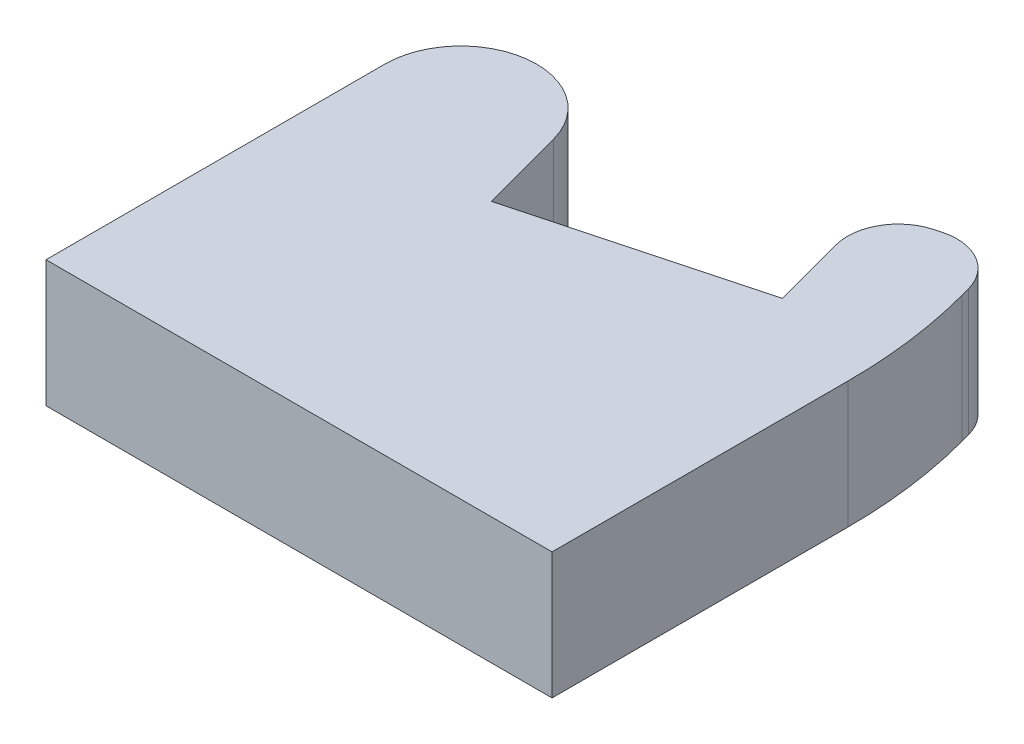
ISO-10303-21;
HEADER;
FILE_DESCRIPTION(('STEP AP214'),'2;1');
FILE_NAME('part.step','',(''),(''),'','','');
FILE_SCHEMA(('AUTOMOTIVE_DESIGN { 1 0 10303 214 1 1 1 1 }'));
ENDSEC;
DATA;
#1=APPLICATION_CONTEXT('core data for automotive mechanical design processes');
#2=APPLICATION_PROTOCOL_DEFINITION('international standard','automotive_design',2000,#1);
#3=PRODUCT_CONTEXT('',#1,'mechanical');
#4=PRODUCT('Part','Part','',(#3));
#5=PRODUCT_RELATED_PRODUCT_CATEGORY('part','',(#4));
#6=PRODUCT_DEFINITION_FORMATION('','',#4);
#7=PRODUCT_DEFINITION_CONTEXT('part definition',#1,'design');
#8=PRODUCT_DEFINITION('design','',#6,#7);
#9=PRODUCT_DEFINITION_SHAPE('','',#8);
#10=(LENGTH_UNIT() NAMED_UNIT(*) SI_UNIT(.MILLI.,.METRE.));
#11=(NAMED_UNIT(*) PLANE_ANGLE_UNIT() SI_UNIT($,.RADIAN.));
#12=(NAMED_UNIT(*) SI_UNIT($,.STERADIAN.) SOLID_ANGLE_UNIT());
#13=UNCERTAINTY_MEASURE_WITH_UNIT(LENGTH_MEASURE(1.E-05),#10,'distance_accuracy_value','');
#14=(GEOMETRIC_REPRESENTATION_CONTEXT(3) GLOBAL_UNCERTAINTY_ASSIGNED_CONTEXT((#13)) GLOBAL_UNIT_ASSIGNED_CONTEXT((#10,
#11,#12)) REPRESENTATION_CONTEXT('',''));
#15=CARTESIAN_POINT('',(0.,0.,0.));
#16=DIRECTION('',(0.,0.,1.));
#17=DIRECTION('',(1.,0.,0.));
#18=AXIS2_PLACEMENT_3D('',#15,#16,#17);
#19=CARTESIAN_POINT('',(0.,6.35,-17.0061676046821));
#20=DIRECTION('',(1.,0.,0.));
#21=DIRECTION('',(0.,0.,-1.));
#22=AXIS2_PLACEMENT_3D('',#19,#20,#21);
#23=PLANE('',#22);
#24=DIRECTION('',(0.,0.,1.));
#25=VECTOR('',#24,1.);
#26=CARTESIAN_POINT('',(0.,0.,-17.0061676046821));
#27=LINE('',#26,#25);
#28=CARTESIAN_POINT('',(0.,0.,-17.0061676046821));
#29=VERTEX_POINT('',#28);
#30=CARTESIAN_POINT('',(0.,0.,0.));
#31=VERTEX_POINT('',#30);
#32=EDGE_CURVE('E153',#29,#31,#27,.T.);
#33=ORIENTED_EDGE('',*,*,#32,.T.);
#34=DIRECTION('',(0.,-1.,0.));
#35=VECTOR('',#34,1.);
#36=CARTESIAN_POINT('',(0.,6.35,0.));
#37=LINE('',#36,#35);
#38=CARTESIAN_POINT('',(0.,6.35,0.));
#39=VERTEX_POINT('',#38);
#40=EDGE_CURVE('E11',#39,#31,#37,.T.);
#41=ORIENTED_EDGE('',*,*,#40,.F.);
#42=DIRECTION('',(0.,0.,1.));
#43=VECTOR('',#42,1.);
#44=CARTESIAN_POINT('',(0.,6.35,-17.0061676046821));
#45=LINE('',#44,#43);
#46=CARTESIAN_POINT('',(0.,6.35,-17.0061676046821));
#47=VERTEX_POINT('',#46);
#48=EDGE_CURVE('E175',#47,#39,#45,.T.);
#49=ORIENTED_EDGE('',*,*,#48,.F.);
#50=DIRECTION('',(0.,-1.,0.));
#51=VECTOR('',#50,1.);
#52=CARTESIAN_POINT('',(0.,6.35,-17.0061676046821));
#53=LINE('',#52,#51);
#54=EDGE_CURVE('E149',#47,#29,#53,.T.);
#55=ORIENTED_EDGE('',*,*,#54,.T.);
#56=EDGE_LOOP('',(#33,#41,#49,#55));
#57=FACE_BOUND('',#56,.T.);
#58=ADVANCED_FACE('F33',(#57),#23,.F.);
#59=CARTESIAN_POINT('',(0.,6.35,0.));
#60=DIRECTION('',(0.,0.,-1.));
#61=DIRECTION('',(-1.,0.,0.));
#62=AXIS2_PLACEMENT_3D('',#59,#60,#61);
#63=PLANE('',#62);
#64=DIRECTION('',(1.,0.,0.));
#65=VECTOR('',#64,1.);
#66=CARTESIAN_POINT('',(0.,0.,0.));
#67=LINE('',#66,#65);
#68=CARTESIAN_POINT('',(25.4,0.,0.));
#69=VERTEX_POINT('',#68);
#70=EDGE_CURVE('E156',#31,#69,#67,.T.);
#71=ORIENTED_EDGE('',*,*,#70,.T.);
#72=DIRECTION('',(0.,-1.,0.));
#73=VECTOR('',#72,1.);
#74=CARTESIAN_POINT('',(25.4,6.35,0.));
#75=LINE('',#74,#73);
#76=CARTESIAN_POINT('',(25.4,6.35,0.));
#77=VERTEX_POINT('',#76);
#78=EDGE_CURVE('E41',#77,#69,#75,.T.);
#79=ORIENTED_EDGE('',*,*,#78,.F.);
#80=DIRECTION('',(1.,0.,0.));
#81=VECTOR('',#80,1.);
#82=CARTESIAN_POINT('',(0.,6.35,0.));
#83=LINE('',#82,#81);
#84=EDGE_CURVE('E104',#39,#77,#83,.T.);
#85=ORIENTED_EDGE('',*,*,#84,.F.);
#86=ORIENTED_EDGE('',*,*,#40,.T.);
#87=EDGE_LOOP('',(#71,#79,#85,#86));
#88=FACE_BOUND('',#87,.T.);
#89=ADVANCED_FACE('F253',(#88),#63,.F.);
#90=CARTESIAN_POINT('',(25.4,6.35,0.));
#91=DIRECTION('',(-1.,0.,0.));
#92=DIRECTION('',(0.,0.,1.));
#93=AXIS2_PLACEMENT_3D('',#90,#91,#92);
#94=PLANE('',#93);
#95=DIRECTION('',(0.,0.,-1.));
#96=VECTOR('',#95,1.);
#97=CARTESIAN_POINT('',(25.4,0.,0.));
#98=LINE('',#97,#96);
#99=CARTESIAN_POINT('',(25.4,0.,-14.8639268231953));
#100=VERTEX_POINT('',#99);
#101=EDGE_CURVE('E158',#69,#100,#98,.T.);
#102=ORIENTED_EDGE('',*,*,#101,.T.);
#103=DIRECTION('',(0.,-1.,0.));
#104=VECTOR('',#103,1.);
#105=CARTESIAN_POINT('',(25.4,6.35,-14.8639268231953));
#106=LINE('',#105,#104);
#107=CARTESIAN_POINT('',(25.4,6.35,-14.8639268231953));
#108=VERTEX_POINT('',#107);
#109=EDGE_CURVE('E194',#108,#100,#106,.T.);
#110=ORIENTED_EDGE('',*,*,#109,.F.);
#111=DIRECTION('',(0.,0.,-1.));
#112=VECTOR('',#111,1.);
#113=CARTESIAN_POINT('',(25.4,6.35,0.));
#114=LINE('',#113,#112);
#115=EDGE_CURVE('E202',#77,#108,#114,.T.);
#116=ORIENTED_EDGE('',*,*,#115,.F.);
#117=ORIENTED_EDGE('',*,*,#78,.T.);
#118=EDGE_LOOP('',(#102,#110,#116,#117));
#119=FACE_BOUND('',#118,.T.);
#120=ADVANCED_FACE('F200',(#119),#94,.F.);
#121=CARTESIAN_POINT('',(0.,6.35,-14.8639268231954));
#122=DIRECTION('',(0.,-1.,0.));
#123=DIRECTION('',(0.,0.,-1.));
#124=AXIS2_PLACEMENT_3D('',#121,#122,#123);
#125=CYLINDRICAL_SURFACE('',#124,25.4);
#126=CARTESIAN_POINT('',(0.,0.,-14.8639268231954));
#127=DIRECTION('',(0.,1.,0.));
#128=DIRECTION('',(0.,0.,1.));
#129=AXIS2_PLACEMENT_3D('',#126,#127,#128);
#130=CIRCLE('',#129,25.4);
#131=CARTESIAN_POINT('',(24.5345159877424,0.,-21.4379305687993));
#132=VERTEX_POINT('',#131);
#133=EDGE_CURVE('E160',#100,#132,#130,.T.);
#134=ORIENTED_EDGE('',*,*,#133,.T.);
#135=DIRECTION('',(0.,-1.,0.));
#136=VECTOR('',#135,1.);
#137=CARTESIAN_POINT('',(24.5345159877424,6.35,-21.4379305687993));
#138=LINE('',#137,#136);
#139=CARTESIAN_POINT('',(24.5345159877424,6.35,-21.4379305687993));
#140=VERTEX_POINT('',#139);
#141=EDGE_CURVE('E191',#140,#132,#138,.T.);
#142=ORIENTED_EDGE('',*,*,#141,.F.);
#143=CARTESIAN_POINT('',(0.,6.35,-14.8639268231954));
#144=DIRECTION('',(0.,1.,0.));
#145=DIRECTION('',(0.,0.,1.));
#146=AXIS2_PLACEMENT_3D('',#143,#144,#145);
#147=CIRCLE('',#146,25.4);
#148=EDGE_CURVE('E220',#108,#140,#147,.T.);
#149=ORIENTED_EDGE('',*,*,#148,.F.);
#150=ORIENTED_EDGE('',*,*,#109,.T.);
#151=EDGE_LOOP('',(#134,#142,#149,#150));
#152=FACE_BOUND('',#151,.T.);
#153=ADVANCED_FACE('F211',(#152),#125,.T.);
#154=CARTESIAN_POINT('',(24.4138994381594,6.35,-21.8880776600766));
#155=DIRECTION('',(-0.965925826289074,0.,0.258819045102501));
#156=DIRECTION('',(0.258819045102501,0.,0.965925826289074));
#157=AXIS2_PLACEMENT_3D('',#154,#155,#156);
#158=PLANE('',#157);
#159=DIRECTION('',(-0.258819045102501,0.,-0.965925826289074));
#160=VECTOR('',#159,1.);
#161=CARTESIAN_POINT('',(24.4138994381594,0.,-21.8880776600766));
#162=LINE('',#161,#160);
#163=CARTESIAN_POINT('',(24.4138994381594,0.,-21.8880776600766));
#164=VERTEX_POINT('',#163);
#165=EDGE_CURVE('E162',#132,#164,#162,.T.);
#166=ORIENTED_EDGE('',*,*,#165,.T.);
#167=DIRECTION('',(0.,-1.,0.));
#168=VECTOR('',#167,1.);
#169=CARTESIAN_POINT('',(24.4138994381594,6.35,-21.8880776600766));
#170=LINE('',#169,#168);
#171=CARTESIAN_POINT('',(24.4138994381594,6.35,-21.8880776600766));
#172=VERTEX_POINT('',#171);
#173=EDGE_CURVE('E188',#172,#164,#170,.T.);
#174=ORIENTED_EDGE('',*,*,#173,.F.);
#175=DIRECTION('',(-0.258819045102501,0.,-0.965925826289074));
#176=VECTOR('',#175,1.);
#177=CARTESIAN_POINT('',(24.4138994381594,6.35,-21.8880776600766));
#178=LINE('',#177,#176);
#179=EDGE_CURVE('E217',#140,#172,#178,.T.);
#180=ORIENTED_EDGE('',*,*,#179,.F.);
#181=ORIENTED_EDGE('',*,*,#141,.T.);
#182=EDGE_LOOP('',(#166,#174,#180,#181));
#183=FACE_BOUND('',#182,.T.);
#184=ADVANCED_FACE('F215',(#183),#158,.F.);
#185=CARTESIAN_POINT('',(21.9604478393852,6.35,-21.2306772855162));
#186=DIRECTION('',(0.,-1.,0.));
#187=DIRECTION('',(0.,0.,-1.));
#188=AXIS2_PLACEMENT_3D('',#185,#186,#187);
#189=CYLINDRICAL_SURFACE('',#188,2.54);
#190=CARTESIAN_POINT('',(21.9604478393852,0.,-21.2306772855162));
#191=DIRECTION('',(0.,1.,0.));
#192=DIRECTION('',(0.,0.,-1.));
#193=AXIS2_PLACEMENT_3D('',#190,#191,#192);
#194=CIRCLE('',#193,2.54);
#195=CARTESIAN_POINT('',(21.3030474648248,0.,-23.6841288842904));
#196=VERTEX_POINT('',#195);
#197=EDGE_CURVE('E164',#164,#196,#194,.T.);
#198=ORIENTED_EDGE('',*,*,#197,.T.);
#199=DIRECTION('',(0.,-1.,0.));
#200=VECTOR('',#199,1.);
#201=CARTESIAN_POINT('',(21.3030474648248,6.35,-23.6841288842904));
#202=LINE('',#201,#200);
#203=CARTESIAN_POINT('',(21.3030474648248,6.35,-23.6841288842904));
#204=VERTEX_POINT('',#203);
#205=EDGE_CURVE('E185',#204,#196,#202,.T.);
#206=ORIENTED_EDGE('',*,*,#205,.F.);
#207=CARTESIAN_POINT('',(21.9604478393852,6.35,-21.2306772855162));
#208=DIRECTION('',(0.,1.,0.));
#209=DIRECTION('',(0.,0.,-1.));
#210=AXIS2_PLACEMENT_3D('',#207,#208,#209);
#211=CIRCLE('',#210,2.54);
#212=EDGE_CURVE('E219',#172,#204,#211,.T.);
#213=ORIENTED_EDGE('',*,*,#212,.F.);
#214=ORIENTED_EDGE('',*,*,#173,.T.);
#215=EDGE_LOOP('',(#198,#206,#213,#214));
#216=FACE_BOUND('',#215,.T.);
#217=ADVANCED_FACE('F266',(#216),#189,.T.);
#218=CARTESIAN_POINT('',(20.9771731766122,6.35,-23.5968111319298));
#219=DIRECTION('',(0.258819045102508,0.,0.965925826289072));
#220=DIRECTION('',(0.965925826289072,0.,-0.258819045102508));
#221=AXIS2_PLACEMENT_3D('',#218,#219,#220);
#222=PLANE('',#221);
#223=DIRECTION('',(-0.965925826289072,0.,0.258819045102508));
#224=VECTOR('',#223,1.);
#225=CARTESIAN_POINT('',(20.9771731766122,0.,-23.5968111319298));
#226=LINE('',#225,#224);
#227=CARTESIAN_POINT('',(20.9771731766122,0.,-23.5968111319298));
#228=VERTEX_POINT('',#227);
#229=EDGE_CURVE('E166',#196,#228,#226,.T.);
#230=ORIENTED_EDGE('',*,*,#229,.T.);
#231=DIRECTION('',(0.,-1.,0.));
#232=VECTOR('',#231,1.);
#233=CARTESIAN_POINT('',(20.9771731766122,6.35,-23.5968111319298));
#234=LINE('',#233,#232);
#235=CARTESIAN_POINT('',(20.9771731766122,6.35,-23.5968111319298));
#236=VERTEX_POINT('',#235);
#237=EDGE_CURVE('E182',#236,#228,#234,.T.);
#238=ORIENTED_EDGE('',*,*,#237,.F.);
#239=DIRECTION('',(-0.965925826289072,0.,0.258819045102508));
#240=VECTOR('',#239,1.);
#241=CARTESIAN_POINT('',(20.9771731766122,6.35,-23.5968111319298));
#242=LINE('',#241,#240);
#243=EDGE_CURVE('E222',#204,#236,#242,.T.);
#244=ORIENTED_EDGE('',*,*,#243,.F.);
#245=ORIENTED_EDGE('',*,*,#205,.T.);
#246=EDGE_LOOP('',(#230,#238,#244,#245));
#247=FACE_BOUND('',#246,.T.);
#248=ADVANCED_FACE('F269',(#247),#222,.F.);
#249=CARTESIAN_POINT('',(21.6345735511726,6.35,-21.1433595331556));
#250=DIRECTION('',(0.,-1.,0.));
#251=DIRECTION('',(0.,0.,-1.));
#252=AXIS2_PLACEMENT_3D('',#249,#250,#251);
#253=CYLINDRICAL_SURFACE('',#252,2.54);
#254=CARTESIAN_POINT('',(21.6345735511726,0.,-21.1433595331556));
#255=DIRECTION('',(0.,1.,0.));
#256=DIRECTION('',(0.,0.,-1.));
#257=AXIS2_PLACEMENT_3D('',#254,#255,#256);
#258=CIRCLE('',#257,2.54);
#259=CARTESIAN_POINT('',(19.1811219523983,0.,-20.4859591585952));
#260=VERTEX_POINT('',#259);
#261=EDGE_CURVE('E168',#228,#260,#258,.T.);
#262=ORIENTED_EDGE('',*,*,#261,.T.);
#263=DIRECTION('',(0.,-1.,0.));
#264=VECTOR('',#263,1.);
#265=CARTESIAN_POINT('',(19.1811219523983,6.35,-20.4859591585952));
#266=LINE('',#265,#264);
#267=CARTESIAN_POINT('',(19.1811219523983,6.35,-20.4859591585952));
#268=VERTEX_POINT('',#267);
#269=EDGE_CURVE('E179',#268,#260,#266,.T.);
#270=ORIENTED_EDGE('',*,*,#269,.F.);
#271=CARTESIAN_POINT('',(21.6345735511726,6.35,-21.1433595331556));
#272=DIRECTION('',(0.,1.,0.));
#273=DIRECTION('',(0.,0.,-1.));
#274=AXIS2_PLACEMENT_3D('',#271,#272,#273);
#275=CIRCLE('',#274,2.54);
#276=EDGE_CURVE('E228',#236,#268,#275,.T.);
#277=ORIENTED_EDGE('',*,*,#276,.F.);
#278=ORIENTED_EDGE('',*,*,#237,.T.);
#279=EDGE_LOOP('',(#262,#270,#277,#278));
#280=FACE_BOUND('',#279,.T.);
#281=ADVANCED_FACE('F234',(#280),#253,.T.);
#282=CARTESIAN_POINT('',(20.1672225142389,6.35,-16.8057817604338));
#283=DIRECTION('',(0.96592582628907,0.,-0.258819045102515));
#284=DIRECTION('',(-0.258819045102515,0.,-0.96592582628907));
#285=AXIS2_PLACEMENT_3D('',#282,#283,#284);
#286=PLANE('',#285);
#287=DIRECTION('',(0.258819045102515,0.,0.96592582628907));
#288=VECTOR('',#287,1.);
#289=CARTESIAN_POINT('',(20.1672225142389,0.,-16.8057817604338));
#290=LINE('',#289,#288);
#291=CARTESIAN_POINT('',(20.1672225142389,0.,-16.8057817604338));
#292=VERTEX_POINT('',#291);
#293=EDGE_CURVE('E170',#260,#292,#290,.T.);
#294=ORIENTED_EDGE('',*,*,#293,.T.);
#295=DIRECTION('',(0.,-1.,0.));
#296=VECTOR('',#295,1.);
#297=CARTESIAN_POINT('',(20.1672225142389,6.35,-16.8057817604338));
#298=LINE('',#297,#296);
#299=CARTESIAN_POINT('',(20.1672225142389,6.35,-16.8057817604338));
#300=VERTEX_POINT('',#299);
#301=EDGE_CURVE('E144',#300,#292,#298,.T.);
#302=ORIENTED_EDGE('',*,*,#301,.F.);
#303=DIRECTION('',(0.258819045102515,0.,0.96592582628907));
#304=VECTOR('',#303,1.);
#305=CARTESIAN_POINT('',(20.1672225142389,6.35,-16.8057817604338));
#306=LINE('',#305,#304);
#307=EDGE_CURVE('E135',#268,#300,#306,.T.);
#308=ORIENTED_EDGE('',*,*,#307,.F.);
#309=ORIENTED_EDGE('',*,*,#269,.T.);
#310=EDGE_LOOP('',(#294,#302,#308,#309));
#311=FACE_BOUND('',#310,.T.);
#312=ADVANCED_FACE('F238',(#311),#286,.F.);
#313=CARTESIAN_POINT('',(20.1672225142389,6.35,-16.8057817604338));
#314=DIRECTION('',(0.258819045102515,0.,0.96592582628907));
#315=DIRECTION('',(0.96592582628907,0.,-0.258819045102515));
#316=AXIS2_PLACEMENT_3D('',#313,#314,#315);
#317=PLANE('',#316);
#318=DIRECTION('',(-0.96592582628907,0.,0.258819045102515));
#319=VECTOR('',#318,1.);
#320=CARTESIAN_POINT('',(20.1672225142389,0.,-16.8057817604338));
#321=LINE('',#320,#319);
#322=CARTESIAN_POINT('',(8.636,0.,-13.716));
#323=VERTEX_POINT('',#322);
#324=EDGE_CURVE('E143',#292,#323,#321,.T.);
#325=ORIENTED_EDGE('',*,*,#324,.T.);
#326=DIRECTION('',(0.,-1.,0.));
#327=VECTOR('',#326,1.);
#328=CARTESIAN_POINT('',(8.636,6.35,-13.716));
#329=LINE('',#328,#327);
#330=CARTESIAN_POINT('',(8.636,6.35,-13.716));
#331=VERTEX_POINT('',#330);
#332=EDGE_CURVE('E140',#331,#323,#329,.T.);
#333=ORIENTED_EDGE('',*,*,#332,.F.);
#334=DIRECTION('',(-0.96592582628907,0.,0.258819045102515));
#335=VECTOR('',#334,1.);
#336=CARTESIAN_POINT('',(20.1672225142389,6.35,-16.8057817604338));
#337=LINE('',#336,#335);
#338=EDGE_CURVE('E129',#300,#331,#337,.T.);
#339=ORIENTED_EDGE('',*,*,#338,.F.);
#340=ORIENTED_EDGE('',*,*,#301,.T.);
#341=EDGE_LOOP('',(#325,#333,#339,#340));
#342=FACE_BOUND('',#341,.T.);
#343=ADVANCED_FACE('F141',(#342),#317,.F.);
#344=CARTESIAN_POINT('',(8.636,6.35,-13.716));
#345=DIRECTION('',(-0.96592582628907,0.,0.258819045102515));
#346=DIRECTION('',(0.258819045102515,0.,0.96592582628907));
#347=AXIS2_PLACEMENT_3D('',#344,#345,#346);
#348=PLANE('',#347);
#349=DIRECTION('',(-0.258819045102515,0.,-0.96592582628907));
#350=VECTOR('',#349,1.);
#351=CARTESIAN_POINT('',(8.636,0.,-13.716));
#352=LINE('',#351,#350);
#353=CARTESIAN_POINT('',(7.49017739816135,0.,-17.9922681665227));
#354=VERTEX_POINT('',#353);
#355=EDGE_CURVE('E90',#323,#354,#352,.T.);
#356=ORIENTED_EDGE('',*,*,#355,.T.);
#357=DIRECTION('',(0.,-1.,0.));
#358=VECTOR('',#357,1.);
#359=CARTESIAN_POINT('',(7.49017739816135,6.35,-17.9922681665227));
#360=LINE('',#359,#358);
#361=CARTESIAN_POINT('',(7.49017739816135,6.35,-17.9922681665227));
#362=VERTEX_POINT('',#361);
#363=EDGE_CURVE('E145',#362,#354,#360,.T.);
#364=ORIENTED_EDGE('',*,*,#363,.F.);
#365=DIRECTION('',(-0.258819045102515,0.,-0.96592582628907));
#366=VECTOR('',#365,1.);
#367=CARTESIAN_POINT('',(8.636,6.35,-13.716));
#368=LINE('',#367,#366);
#369=EDGE_CURVE('E133',#331,#362,#368,.T.);
#370=ORIENTED_EDGE('',*,*,#369,.F.);
#371=ORIENTED_EDGE('',*,*,#332,.T.);
#372=EDGE_LOOP('',(#356,#364,#370,#371));
#373=FACE_BOUND('',#372,.T.);
#374=ADVANCED_FACE('F147',(#373),#348,.F.);
#375=CARTESIAN_POINT('',(3.81,6.35,-17.0061676046821));
#376=DIRECTION('',(0.,-1.,0.));
#377=DIRECTION('',(0.,0.,-1.));
#378=AXIS2_PLACEMENT_3D('',#375,#376,#377);
#379=CYLINDRICAL_SURFACE('',#378,3.81);
#380=CARTESIAN_POINT('',(3.81,0.,-17.0061676046821));
#381=DIRECTION('',(0.,1.,0.));
#382=DIRECTION('',(0.,0.,1.));
#383=AXIS2_PLACEMENT_3D('',#380,#381,#382);
#384=CIRCLE('',#383,3.81);
#385=EDGE_CURVE('E96',#354,#29,#384,.T.);
#386=ORIENTED_EDGE('',*,*,#385,.T.);
#387=ORIENTED_EDGE('',*,*,#54,.F.);
#388=CARTESIAN_POINT('',(3.81,6.35,-17.0061676046821));
#389=DIRECTION('',(0.,1.,0.));
#390=DIRECTION('',(0.,0.,1.));
#391=AXIS2_PLACEMENT_3D('',#388,#389,#390);
#392=CIRCLE('',#391,3.81);
#393=EDGE_CURVE('E49',#362,#47,#392,.T.);
#394=ORIENTED_EDGE('',*,*,#393,.F.);
#395=ORIENTED_EDGE('',*,*,#363,.T.);
#396=EDGE_LOOP('',(#386,#387,#394,#395));
#397=FACE_BOUND('',#396,.T.);
#398=ADVANCED_FACE('F242',(#397),#379,.T.);
#399=CARTESIAN_POINT('',(0.,6.35,-14.8639268231954));
#400=DIRECTION('',(0.,1.,0.));
#401=DIRECTION('',(0.,0.,1.));
#402=AXIS2_PLACEMENT_3D('',#399,#400,#401);
#403=PLANE('',#402);
#404=ORIENTED_EDGE('',*,*,#48,.T.);
#405=ORIENTED_EDGE('',*,*,#84,.T.);
#406=ORIENTED_EDGE('',*,*,#115,.T.);
#407=ORIENTED_EDGE('',*,*,#148,.T.);
#408=ORIENTED_EDGE('',*,*,#179,.T.);
#409=ORIENTED_EDGE('',*,*,#212,.T.);
#410=ORIENTED_EDGE('',*,*,#243,.T.);
#411=ORIENTED_EDGE('',*,*,#276,.T.);
#412=ORIENTED_EDGE('',*,*,#307,.T.);
#413=ORIENTED_EDGE('',*,*,#338,.T.);
#414=ORIENTED_EDGE('',*,*,#369,.T.);
#415=ORIENTED_EDGE('',*,*,#393,.T.);
#416=EDGE_LOOP('',(#404,#405,#406,#407,#408,#409,#410,#411,#412,#413,#414,#415));
#417=FACE_BOUND('',#416,.T.);
#418=ADVANCED_FACE('F131',(#417),#403,.T.);
#419=CARTESIAN_POINT('',(0.,0.,-14.8639268231954));
#420=DIRECTION('',(0.,1.,0.));
#421=DIRECTION('',(0.,0.,1.));
#422=AXIS2_PLACEMENT_3D('',#419,#420,#421);
#423=PLANE('',#422);
#424=ORIENTED_EDGE('',*,*,#32,.F.);
#425=ORIENTED_EDGE('',*,*,#385,.F.);
#426=ORIENTED_EDGE('',*,*,#355,.F.);
#427=ORIENTED_EDGE('',*,*,#324,.F.);
#428=ORIENTED_EDGE('',*,*,#293,.F.);
#429=ORIENTED_EDGE('',*,*,#261,.F.);
#430=ORIENTED_EDGE('',*,*,#229,.F.);
#431=ORIENTED_EDGE('',*,*,#197,.F.);
#432=ORIENTED_EDGE('',*,*,#165,.F.);
#433=ORIENTED_EDGE('',*,*,#133,.F.);
#434=ORIENTED_EDGE('',*,*,#101,.F.);
#435=ORIENTED_EDGE('',*,*,#70,.F.);
#436=EDGE_LOOP('',(#424,#425,#426,#427,#428,#429,#430,#431,#432,#433,#434,#435));
#437=FACE_BOUND('',#436,.T.);
#438=ADVANCED_FACE('F206',(#437),#423,.F.);
#439=CLOSED_SHELL('',(#58,#89,#120,#153,#184,#217,#248,#281,#312,#343,#374,#398,#418,#438));
#440=MANIFOLD_SOLID_BREP('B2',#439);
#441=ADVANCED_BREP_SHAPE_REPRESENTATION('',(#18,#440),#14);
#442=SHAPE_DEFINITION_REPRESENTATION(#9,#441);
ENDSEC;
END-ISO-10303-21;
